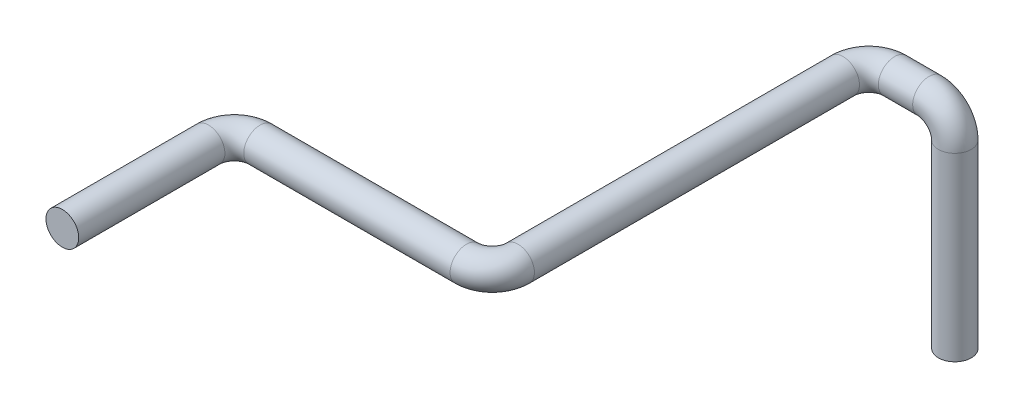
ISO-10303-21;
HEADER;
FILE_DESCRIPTION(('STEP AP214'),'2;1');
FILE_NAME('part.step','',(''),(''),'','','');
FILE_SCHEMA(('AUTOMOTIVE_DESIGN { 1 0 10303 214 1 1 1 1 }'));
ENDSEC;
DATA;
#1=APPLICATION_CONTEXT('core data for automotive mechanical design processes');
#2=APPLICATION_PROTOCOL_DEFINITION('international standard','automotive_design',2000,#1);
#3=PRODUCT_CONTEXT('',#1,'mechanical');
#4=PRODUCT('Part','Part','',(#3));
#5=PRODUCT_RELATED_PRODUCT_CATEGORY('part','',(#4));
#6=PRODUCT_DEFINITION_FORMATION('','',#4);
#7=PRODUCT_DEFINITION_CONTEXT('part definition',#1,'design');
#8=PRODUCT_DEFINITION('design','',#6,#7);
#9=PRODUCT_DEFINITION_SHAPE('','',#8);
#10=(LENGTH_UNIT() NAMED_UNIT(*) SI_UNIT(.MILLI.,.METRE.));
#11=(NAMED_UNIT(*) PLANE_ANGLE_UNIT() SI_UNIT($,.RADIAN.));
#12=(NAMED_UNIT(*) SI_UNIT($,.STERADIAN.) SOLID_ANGLE_UNIT());
#13=UNCERTAINTY_MEASURE_WITH_UNIT(LENGTH_MEASURE(1.E-05),#10,'distance_accuracy_value','');
#14=(GEOMETRIC_REPRESENTATION_CONTEXT(3) GLOBAL_UNCERTAINTY_ASSIGNED_CONTEXT((#13)) GLOBAL_UNIT_ASSIGNED_CONTEXT((#10,
#11,#12)) REPRESENTATION_CONTEXT('',''));
#15=CARTESIAN_POINT('',(0.,0.,0.));
#16=DIRECTION('',(0.,0.,1.));
#17=DIRECTION('',(1.,0.,0.));
#18=AXIS2_PLACEMENT_3D('',#15,#16,#17);
#19=CARTESIAN_POINT('',(0.,10.,0.));
#20=DIRECTION('',(0.,-1.,0.));
#21=DIRECTION('',(0.,0.,-1.));
#22=AXIS2_PLACEMENT_3D('',#19,#20,#21);
#23=CYLINDRICAL_SURFACE('',#22,9.525);
#24=CARTESIAN_POINT('',(0.,0.,0.));
#25=DIRECTION('',(0.,1.,0.));
#26=DIRECTION('',(0.,0.,1.));
#27=AXIS2_PLACEMENT_3D('',#24,#25,#26);
#28=CIRCLE('',#27,9.525);
#29=CARTESIAN_POINT('',(0.,0.,9.525));
#30=VERTEX_POINT('',#29);
#31=EDGE_CURVE('E11',#30,#30,#28,.T.);
#32=ORIENTED_EDGE('',*,*,#31,.T.);
#33=EDGE_LOOP('',(#32));
#34=FACE_BOUND('',#33,.T.);
#35=CARTESIAN_POINT('',(0.,105.,0.));
#36=DIRECTION('',(0.,1.,0.));
#37=DIRECTION('',(0.,0.,1.));
#38=AXIS2_PLACEMENT_3D('',#35,#36,#37);
#39=CIRCLE('',#38,9.525);
#40=CARTESIAN_POINT('',(9.525,105.,0.));
#41=VERTEX_POINT('',#40);
#42=EDGE_CURVE('E69',#41,#41,#39,.T.);
#43=ORIENTED_EDGE('',*,*,#42,.F.);
#44=EDGE_LOOP('',(#43));
#45=FACE_BOUND('',#44,.T.);
#46=ADVANCED_FACE('F35',(#34,#45),#23,.T.);
#47=CARTESIAN_POINT('',(0.,0.,0.));
#48=DIRECTION('',(0.,1.,0.));
#49=DIRECTION('',(0.,0.,1.));
#50=AXIS2_PLACEMENT_3D('',#47,#48,#49);
#51=PLANE('',#50);
#52=ORIENTED_EDGE('',*,*,#31,.F.);
#53=EDGE_LOOP('',(#52));
#54=FACE_BOUND('',#53,.T.);
#55=ADVANCED_FACE('F76',(#54),#51,.F.);
#56=CARTESIAN_POINT('',(-200.,120.,319.));
#57=DIRECTION('',(0.,0.,1.));
#58=DIRECTION('',(1.,0.,0.));
#59=AXIS2_PLACEMENT_3D('',#56,#57,#58);
#60=PLANE('',#59);
#61=CARTESIAN_POINT('',(-200.,120.,319.));
#62=DIRECTION('',(0.,0.,1.));
#63=DIRECTION('',(1.,0.,0.));
#64=AXIS2_PLACEMENT_3D('',#61,#62,#63);
#65=CIRCLE('',#64,9.525);
#66=CARTESIAN_POINT('',(-190.475,120.,319.));
#67=VERTEX_POINT('',#66);
#68=EDGE_CURVE('E41',#67,#67,#65,.T.);
#69=ORIENTED_EDGE('',*,*,#68,.T.);
#70=EDGE_LOOP('',(#69));
#71=FACE_BOUND('',#70,.T.);
#72=ADVANCED_FACE('F45',(#71),#60,.T.);
#73=CARTESIAN_POINT('',(-15.,105.,0.));
#74=DIRECTION('',(0.,0.,1.));
#75=DIRECTION('',(1.,0.,0.));
#76=AXIS2_PLACEMENT_3D('',#73,#74,#75);
#77=TOROIDAL_SURFACE('',#76,15.,9.525);
#78=CARTESIAN_POINT('',(-15.,120.,0.));
#79=DIRECTION('',(-1.,0.,0.));
#80=DIRECTION('',(0.,0.,1.));
#81=AXIS2_PLACEMENT_3D('',#78,#79,#80);
#82=CIRCLE('',#81,9.525);
#83=CARTESIAN_POINT('',(-15.,129.525,0.));
#84=VERTEX_POINT('',#83);
#85=EDGE_CURVE('E66',#84,#84,#82,.T.);
#86=CARTESIAN_POINT('',(-15.,105.,0.));
#87=DIRECTION('',(0.,0.,1.));
#88=DIRECTION('',(1.,0.,0.));
#89=AXIS2_PLACEMENT_3D('',#86,#87,#88);
#90=CIRCLE('',#89,24.525);
#91=EDGE_CURVE('',#41,#84,#90,.T.);
#92=ORIENTED_EDGE('',*,*,#42,.T.);
#93=ORIENTED_EDGE('',*,*,#85,.F.);
#94=ORIENTED_EDGE('',*,*,#91,.T.);
#95=ORIENTED_EDGE('',*,*,#91,.F.);
#96=EDGE_LOOP('',(#92,#94,#93,#95));
#97=FACE_BOUND('',#96,.T.);
#98=ADVANCED_FACE('F73',(#97),#77,.T.);
#99=CARTESIAN_POINT('',(-15.,120.,0.));
#100=DIRECTION('',(-1.,0.,0.));
#101=DIRECTION('',(0.,0.,1.));
#102=AXIS2_PLACEMENT_3D('',#99,#100,#101);
#103=CYLINDRICAL_SURFACE('',#102,9.525);
#104=CARTESIAN_POINT('',(-35.,120.,0.));
#105=DIRECTION('',(-1.,0.,0.));
#106=DIRECTION('',(0.,0.,1.));
#107=AXIS2_PLACEMENT_3D('',#104,#105,#106);
#108=CIRCLE('',#107,9.525);
#109=CARTESIAN_POINT('',(-35.,120.,-9.525));
#110=VERTEX_POINT('',#109);
#111=EDGE_CURVE('E63',#110,#110,#108,.T.);
#112=ORIENTED_EDGE('',*,*,#111,.F.);
#113=EDGE_LOOP('',(#112));
#114=FACE_BOUND('',#113,.T.);
#115=ORIENTED_EDGE('',*,*,#85,.T.);
#116=EDGE_LOOP('',(#115));
#117=FACE_BOUND('',#116,.T.);
#118=ADVANCED_FACE('F113',(#114,#117),#103,.T.);
#119=CARTESIAN_POINT('',(-35.,120.,15.));
#120=DIRECTION('',(0.,1.,0.));
#121=DIRECTION('',(0.,0.,1.));
#122=AXIS2_PLACEMENT_3D('',#119,#120,#121);
#123=TOROIDAL_SURFACE('',#122,15.,9.525);
#124=CARTESIAN_POINT('',(-50.,120.,15.));
#125=DIRECTION('',(0.,0.,1.));
#126=DIRECTION('',(1.,0.,0.));
#127=AXIS2_PLACEMENT_3D('',#124,#125,#126);
#128=CIRCLE('',#127,9.525);
#129=CARTESIAN_POINT('',(-59.525,120.,15.));
#130=VERTEX_POINT('',#129);
#131=EDGE_CURVE('E60',#130,#130,#128,.T.);
#132=CARTESIAN_POINT('',(-35.,120.,15.));
#133=DIRECTION('',(0.,1.,0.));
#134=DIRECTION('',(0.,0.,1.));
#135=AXIS2_PLACEMENT_3D('',#132,#133,#134);
#136=CIRCLE('',#135,24.525);
#137=EDGE_CURVE('',#110,#130,#136,.T.);
#138=ORIENTED_EDGE('',*,*,#111,.T.);
#139=ORIENTED_EDGE('',*,*,#131,.F.);
#140=ORIENTED_EDGE('',*,*,#137,.T.);
#141=ORIENTED_EDGE('',*,*,#137,.F.);
#142=EDGE_LOOP('',(#138,#140,#139,#141));
#143=FACE_BOUND('',#142,.T.);
#144=ADVANCED_FACE('F109',(#143),#123,.T.);
#145=CARTESIAN_POINT('',(-50.,120.,15.));
#146=DIRECTION('',(0.,0.,1.));
#147=DIRECTION('',(1.,0.,0.));
#148=AXIS2_PLACEMENT_3D('',#145,#146,#147);
#149=CYLINDRICAL_SURFACE('',#148,9.525);
#150=CARTESIAN_POINT('',(-50.,120.,204.));
#151=DIRECTION('',(0.,0.,1.));
#152=DIRECTION('',(1.,0.,0.));
#153=AXIS2_PLACEMENT_3D('',#150,#151,#152);
#154=CIRCLE('',#153,9.525);
#155=CARTESIAN_POINT('',(-40.475,120.,204.));
#156=VERTEX_POINT('',#155);
#157=EDGE_CURVE('E57',#156,#156,#154,.T.);
#158=ORIENTED_EDGE('',*,*,#157,.F.);
#159=EDGE_LOOP('',(#158));
#160=FACE_BOUND('',#159,.T.);
#161=ORIENTED_EDGE('',*,*,#131,.T.);
#162=EDGE_LOOP('',(#161));
#163=FACE_BOUND('',#162,.T.);
#164=ADVANCED_FACE('F105',(#160,#163),#149,.T.);
#165=CARTESIAN_POINT('',(-65.,120.,204.));
#166=DIRECTION('',(0.,-1.,0.));
#167=DIRECTION('',(0.,0.,-1.));
#168=AXIS2_PLACEMENT_3D('',#165,#166,#167);
#169=TOROIDAL_SURFACE('',#168,15.,9.525);
#170=CARTESIAN_POINT('',(-65.,120.,219.));
#171=DIRECTION('',(-1.,0.,0.));
#172=DIRECTION('',(0.,0.,1.));
#173=AXIS2_PLACEMENT_3D('',#170,#171,#172);
#174=CIRCLE('',#173,9.525);
#175=CARTESIAN_POINT('',(-65.,120.,228.525));
#176=VERTEX_POINT('',#175);
#177=EDGE_CURVE('E54',#176,#176,#174,.T.);
#178=CARTESIAN_POINT('',(-65.,120.,204.));
#179=DIRECTION('',(0.,-1.,0.));
#180=DIRECTION('',(0.,0.,-1.));
#181=AXIS2_PLACEMENT_3D('',#178,#179,#180);
#182=CIRCLE('',#181,24.525);
#183=EDGE_CURVE('',#156,#176,#182,.T.);
#184=ORIENTED_EDGE('',*,*,#157,.T.);
#185=ORIENTED_EDGE('',*,*,#177,.F.);
#186=ORIENTED_EDGE('',*,*,#183,.T.);
#187=ORIENTED_EDGE('',*,*,#183,.F.);
#188=EDGE_LOOP('',(#184,#186,#185,#187));
#189=FACE_BOUND('',#188,.T.);
#190=ADVANCED_FACE('F101',(#189),#169,.T.);
#191=CARTESIAN_POINT('',(-65.,120.,219.));
#192=DIRECTION('',(-1.,0.,0.));
#193=DIRECTION('',(0.,-1.,0.));
#194=AXIS2_PLACEMENT_3D('',#191,#192,#193);
#195=CYLINDRICAL_SURFACE('',#194,9.525);
#196=CARTESIAN_POINT('',(-185.,120.,219.));
#197=DIRECTION('',(-1.,0.,0.));
#198=DIRECTION('',(0.,0.,1.));
#199=AXIS2_PLACEMENT_3D('',#196,#197,#198);
#200=CIRCLE('',#199,9.525);
#201=CARTESIAN_POINT('',(-185.,120.,209.475));
#202=VERTEX_POINT('',#201);
#203=EDGE_CURVE('E49',#202,#202,#200,.T.);
#204=ORIENTED_EDGE('',*,*,#203,.F.);
#205=EDGE_LOOP('',(#204));
#206=FACE_BOUND('',#205,.T.);
#207=ORIENTED_EDGE('',*,*,#177,.T.);
#208=EDGE_LOOP('',(#207));
#209=FACE_BOUND('',#208,.T.);
#210=ADVANCED_FACE('F94',(#206,#209),#195,.T.);
#211=CARTESIAN_POINT('',(-185.,120.,234.));
#212=DIRECTION('',(0.,1.,0.));
#213=DIRECTION('',(-1.,0.,0.));
#214=AXIS2_PLACEMENT_3D('',#211,#212,#213);
#215=TOROIDAL_SURFACE('',#214,15.,9.525);
#216=CARTESIAN_POINT('',(-200.,120.,234.));
#217=DIRECTION('',(0.,0.,1.));
#218=DIRECTION('',(1.,0.,0.));
#219=AXIS2_PLACEMENT_3D('',#216,#217,#218);
#220=CIRCLE('',#219,9.525);
#221=CARTESIAN_POINT('',(-209.525,120.,234.));
#222=VERTEX_POINT('',#221);
#223=EDGE_CURVE('E47',#222,#222,#220,.T.);
#224=CARTESIAN_POINT('',(-185.,120.,234.));
#225=DIRECTION('',(0.,1.,0.));
#226=DIRECTION('',(-1.,0.,0.));
#227=AXIS2_PLACEMENT_3D('',#224,#225,#226);
#228=CIRCLE('',#227,24.525);
#229=EDGE_CURVE('',#202,#222,#228,.T.);
#230=ORIENTED_EDGE('',*,*,#203,.T.);
#231=ORIENTED_EDGE('',*,*,#223,.F.);
#232=ORIENTED_EDGE('',*,*,#229,.T.);
#233=ORIENTED_EDGE('',*,*,#229,.F.);
#234=EDGE_LOOP('',(#230,#232,#231,#233));
#235=FACE_BOUND('',#234,.T.);
#236=ADVANCED_FACE('F89',(#235),#215,.T.);
#237=CARTESIAN_POINT('',(-200.,120.,234.));
#238=DIRECTION('',(0.,0.,1.));
#239=DIRECTION('',(0.,-1.,0.));
#240=AXIS2_PLACEMENT_3D('',#237,#238,#239);
#241=CYLINDRICAL_SURFACE('',#240,9.525);
#242=ORIENTED_EDGE('',*,*,#68,.F.);
#243=EDGE_LOOP('',(#242));
#244=FACE_BOUND('',#243,.T.);
#245=ORIENTED_EDGE('',*,*,#223,.T.);
#246=EDGE_LOOP('',(#245));
#247=FACE_BOUND('',#246,.T.);
#248=ADVANCED_FACE('F82',(#244,#247),#241,.T.);
#249=CLOSED_SHELL('',(#46,#55,#72,#98,#118,#144,#164,#190,#210,#236,#248));
#250=MANIFOLD_SOLID_BREP('B2',#249);
#251=ADVANCED_BREP_SHAPE_REPRESENTATION('',(#18,#250),#14);
#252=SHAPE_DEFINITION_REPRESENTATION(#9,#251);
ENDSEC;
END-ISO-10303-21;
